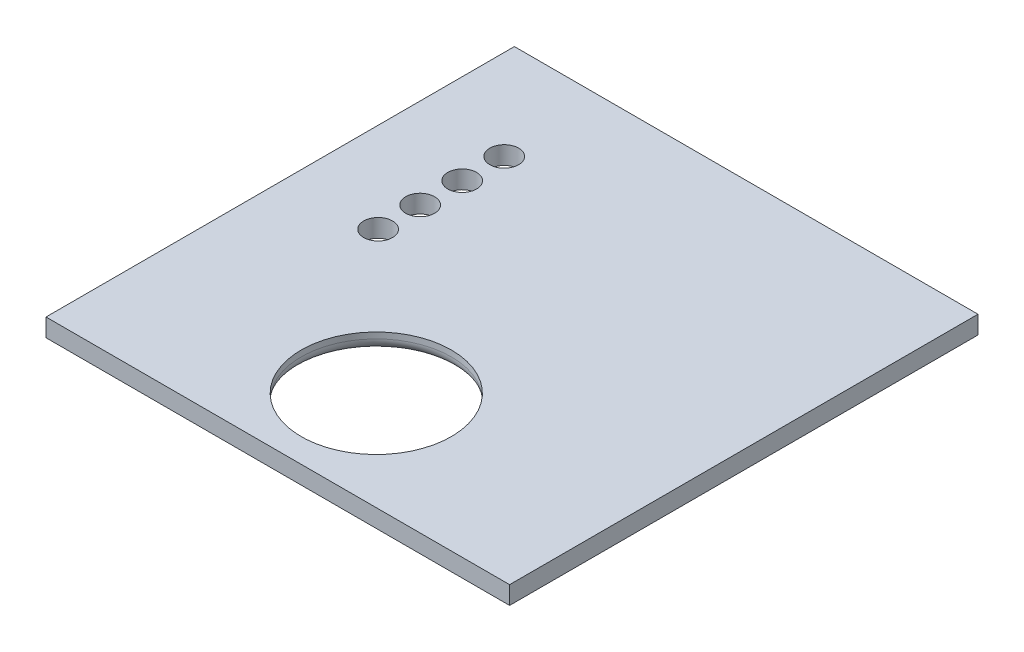
ISO-10303-21;
HEADER;
FILE_DESCRIPTION(('STEP AP214'),'2;1');
FILE_NAME('part.step','',(''),(''),'','','');
FILE_SCHEMA(('AUTOMOTIVE_DESIGN { 1 0 10303 214 1 1 1 1 }'));
ENDSEC;
DATA;
#1=APPLICATION_CONTEXT('core data for automotive mechanical design processes');
#2=APPLICATION_PROTOCOL_DEFINITION('international standard','automotive_design',2000,#1);
#3=PRODUCT_CONTEXT('',#1,'mechanical');
#4=PRODUCT('Part','Part','',(#3));
#5=PRODUCT_RELATED_PRODUCT_CATEGORY('part','',(#4));
#6=PRODUCT_DEFINITION_FORMATION('','',#4);
#7=PRODUCT_DEFINITION_CONTEXT('part definition',#1,'design');
#8=PRODUCT_DEFINITION('design','',#6,#7);
#9=PRODUCT_DEFINITION_SHAPE('','',#8);
#10=(LENGTH_UNIT() NAMED_UNIT(*) SI_UNIT(.MILLI.,.METRE.));
#11=(NAMED_UNIT(*) PLANE_ANGLE_UNIT() SI_UNIT($,.RADIAN.));
#12=(NAMED_UNIT(*) SI_UNIT($,.STERADIAN.) SOLID_ANGLE_UNIT());
#13=UNCERTAINTY_MEASURE_WITH_UNIT(LENGTH_MEASURE(1.E-05),#10,'distance_accuracy_value','');
#14=(GEOMETRIC_REPRESENTATION_CONTEXT(3) GLOBAL_UNCERTAINTY_ASSIGNED_CONTEXT((#13)) GLOBAL_UNIT_ASSIGNED_CONTEXT((#10,
#11,#12)) REPRESENTATION_CONTEXT('',''));
#15=CARTESIAN_POINT('',(0.,0.,0.));
#16=DIRECTION('',(0.,0.,1.));
#17=DIRECTION('',(1.,0.,0.));
#18=AXIS2_PLACEMENT_3D('',#15,#16,#17);
#19=CARTESIAN_POINT('',(0.,0.,0.));
#20=DIRECTION('',(0.,1.,0.));
#21=DIRECTION('',(0.,0.,1.));
#22=AXIS2_PLACEMENT_3D('',#19,#20,#21);
#23=PLANE('',#22);
#24=CARTESIAN_POINT('',(-119.676362237991,0.,-25.0492108688671));
#25=DIRECTION('',(0.,1.,0.));
#26=DIRECTION('',(0.,0.,1.));
#27=AXIS2_PLACEMENT_3D('',#24,#25,#26);
#28=CIRCLE('',#27,14.5);
#29=CARTESIAN_POINT('',(-119.676362237991,0.,-10.5492108688671));
#30=VERTEX_POINT('',#29);
#31=EDGE_CURVE('E11',#30,#30,#28,.T.);
#32=ORIENTED_EDGE('',*,*,#31,.T.);
#33=EDGE_LOOP('',(#32));
#34=FACE_BOUND('',#33,.T.);
#35=CARTESIAN_POINT('',(-143.176362237991,0.,-69.8555580653127));
#36=DIRECTION('',(0.,1.,0.));
#37=DIRECTION('',(0.,0.,1.));
#38=AXIS2_PLACEMENT_3D('',#35,#36,#37);
#39=CIRCLE('',#38,2.4);
#40=CARTESIAN_POINT('',(-143.176362237991,0.,-67.4555580653127));
#41=VERTEX_POINT('',#40);
#42=EDGE_CURVE('E128',#41,#41,#39,.F.);
#43=ORIENTED_EDGE('',*,*,#42,.F.);
#44=EDGE_LOOP('',(#43));
#45=FACE_BOUND('',#44,.T.);
#46=CARTESIAN_POINT('',(-143.176362237991,0.,-62.8555580653127));
#47=DIRECTION('',(0.,1.,0.));
#48=DIRECTION('',(0.,0.,1.));
#49=AXIS2_PLACEMENT_3D('',#46,#47,#48);
#50=CIRCLE('',#49,2.4);
#51=CARTESIAN_POINT('',(-143.176362237991,0.,-60.4555580653127));
#52=VERTEX_POINT('',#51);
#53=EDGE_CURVE('E124',#52,#52,#50,.F.);
#54=ORIENTED_EDGE('',*,*,#53,.F.);
#55=EDGE_LOOP('',(#54));
#56=FACE_BOUND('',#55,.T.);
#57=CARTESIAN_POINT('',(-143.176362237991,0.,-55.8555580653127));
#58=DIRECTION('',(0.,1.,0.));
#59=DIRECTION('',(0.,0.,1.));
#60=AXIS2_PLACEMENT_3D('',#57,#58,#59);
#61=CIRCLE('',#60,2.4);
#62=CARTESIAN_POINT('',(-143.176362237991,0.,-53.4555580653127));
#63=VERTEX_POINT('',#62);
#64=EDGE_CURVE('E120',#63,#63,#61,.F.);
#65=ORIENTED_EDGE('',*,*,#64,.F.);
#66=EDGE_LOOP('',(#65));
#67=FACE_BOUND('',#66,.T.);
#68=CARTESIAN_POINT('',(-143.176362237991,0.,-48.8555580653127));
#69=DIRECTION('',(0.,1.,0.));
#70=DIRECTION('',(0.,0.,1.));
#71=AXIS2_PLACEMENT_3D('',#68,#69,#70);
#72=CIRCLE('',#71,2.4);
#73=CARTESIAN_POINT('',(-143.176362237991,0.,-46.4555580653127));
#74=VERTEX_POINT('',#73);
#75=EDGE_CURVE('E115',#74,#74,#72,.F.);
#76=ORIENTED_EDGE('',*,*,#75,.F.);
#77=EDGE_LOOP('',(#76));
#78=FACE_BOUND('',#77,.T.);
#79=DIRECTION('',(0.,0.,1.));
#80=VECTOR('',#79,1.);
#81=CARTESIAN_POINT('',(-158.176362237991,0.,-86.5492108688671));
#82=LINE('',#81,#80);
#83=CARTESIAN_POINT('',(-158.176362237991,0.,-86.5492108688671));
#84=VERTEX_POINT('',#83);
#85=CARTESIAN_POINT('',(-158.176362237991,0.,-8.54921086886712));
#86=VERTEX_POINT('',#85);
#87=EDGE_CURVE('E105',#84,#86,#82,.T.);
#88=ORIENTED_EDGE('',*,*,#87,.F.);
#89=DIRECTION('',(-1.,0.,0.));
#90=VECTOR('',#89,1.);
#91=CARTESIAN_POINT('',(-158.176362237991,0.,-86.5492108688671));
#92=LINE('',#91,#90);
#93=CARTESIAN_POINT('',(-80.9763622379913,0.,-86.5492108688671));
#94=VERTEX_POINT('',#93);
#95=EDGE_CURVE('E77',#94,#84,#92,.T.);
#96=ORIENTED_EDGE('',*,*,#95,.F.);
#97=DIRECTION('',(0.,0.,-1.));
#98=VECTOR('',#97,1.);
#99=CARTESIAN_POINT('',(-80.9763622379913,0.,-86.5492108688671));
#100=LINE('',#99,#98);
#101=CARTESIAN_POINT('',(-80.9763622379913,0.,-8.54921086886712));
#102=VERTEX_POINT('',#101);
#103=EDGE_CURVE('E71',#102,#94,#100,.T.);
#104=ORIENTED_EDGE('',*,*,#103,.F.);
#105=DIRECTION('',(1.,0.,0.));
#106=VECTOR('',#105,1.);
#107=CARTESIAN_POINT('',(-158.176362237991,0.,-8.54921086886712));
#108=LINE('',#107,#106);
#109=EDGE_CURVE('E95',#86,#102,#108,.T.);
#110=ORIENTED_EDGE('',*,*,#109,.F.);
#111=EDGE_LOOP('',(#88,#96,#104,#110));
#112=FACE_BOUND('',#111,.T.);
#113=ADVANCED_FACE('F37',(#34,#45,#56,#67,#78,#112),#23,.F.);
#114=CARTESIAN_POINT('',(-158.176362237991,3.,-86.5492108688671));
#115=DIRECTION('',(1.,0.,0.));
#116=DIRECTION('',(0.,0.,-1.));
#117=AXIS2_PLACEMENT_3D('',#114,#115,#116);
#118=PLANE('',#117);
#119=ORIENTED_EDGE('',*,*,#87,.T.);
#120=DIRECTION('',(0.,-1.,0.));
#121=VECTOR('',#120,1.);
#122=CARTESIAN_POINT('',(-158.176362237991,3.,-8.54921086886712));
#123=LINE('',#122,#121);
#124=CARTESIAN_POINT('',(-158.176362237991,3.,-8.54921086886712));
#125=VERTEX_POINT('',#124);
#126=EDGE_CURVE('E96',#125,#86,#123,.T.);
#127=ORIENTED_EDGE('',*,*,#126,.F.);
#128=DIRECTION('',(0.,0.,1.));
#129=VECTOR('',#128,1.);
#130=CARTESIAN_POINT('',(-158.176362237991,3.,-86.5492108688671));
#131=LINE('',#130,#129);
#132=CARTESIAN_POINT('',(-158.176362237991,3.,-86.5492108688671));
#133=VERTEX_POINT('',#132);
#134=EDGE_CURVE('E90',#133,#125,#131,.T.);
#135=ORIENTED_EDGE('',*,*,#134,.F.);
#136=DIRECTION('',(0.,-1.,0.));
#137=VECTOR('',#136,1.);
#138=CARTESIAN_POINT('',(-158.176362237991,3.,-86.5492108688671));
#139=LINE('',#138,#137);
#140=EDGE_CURVE('E101',#133,#84,#139,.T.);
#141=ORIENTED_EDGE('',*,*,#140,.T.);
#142=EDGE_LOOP('',(#119,#127,#135,#141));
#143=FACE_BOUND('',#142,.T.);
#144=ADVANCED_FACE('F145',(#143),#118,.F.);
#145=CARTESIAN_POINT('',(-158.176362237991,3.,-8.54921086886712));
#146=DIRECTION('',(0.,0.,-1.));
#147=DIRECTION('',(-1.,0.,0.));
#148=AXIS2_PLACEMENT_3D('',#145,#146,#147);
#149=PLANE('',#148);
#150=ORIENTED_EDGE('',*,*,#109,.T.);
#151=DIRECTION('',(0.,-1.,0.));
#152=VECTOR('',#151,1.);
#153=CARTESIAN_POINT('',(-80.9763622379913,3.,-8.54921086886712));
#154=LINE('',#153,#152);
#155=CARTESIAN_POINT('',(-80.9763622379913,3.,-8.54921086886712));
#156=VERTEX_POINT('',#155);
#157=EDGE_CURVE('E93',#156,#102,#154,.T.);
#158=ORIENTED_EDGE('',*,*,#157,.F.);
#159=DIRECTION('',(1.,0.,0.));
#160=VECTOR('',#159,1.);
#161=CARTESIAN_POINT('',(-158.176362237991,3.,-8.54921086886712));
#162=LINE('',#161,#160);
#163=EDGE_CURVE('E85',#125,#156,#162,.T.);
#164=ORIENTED_EDGE('',*,*,#163,.F.);
#165=ORIENTED_EDGE('',*,*,#126,.T.);
#166=EDGE_LOOP('',(#150,#158,#164,#165));
#167=FACE_BOUND('',#166,.T.);
#168=ADVANCED_FACE('F94',(#167),#149,.F.);
#169=CARTESIAN_POINT('',(-80.9763622379913,3.,-86.5492108688671));
#170=DIRECTION('',(-1.,0.,0.));
#171=DIRECTION('',(0.,0.,1.));
#172=AXIS2_PLACEMENT_3D('',#169,#170,#171);
#173=PLANE('',#172);
#174=ORIENTED_EDGE('',*,*,#103,.T.);
#175=DIRECTION('',(0.,-1.,0.));
#176=VECTOR('',#175,1.);
#177=CARTESIAN_POINT('',(-80.9763622379913,3.,-86.5492108688671));
#178=LINE('',#177,#176);
#179=CARTESIAN_POINT('',(-80.9763622379913,3.,-86.5492108688671));
#180=VERTEX_POINT('',#179);
#181=EDGE_CURVE('E97',#180,#94,#178,.T.);
#182=ORIENTED_EDGE('',*,*,#181,.F.);
#183=DIRECTION('',(0.,0.,-1.));
#184=VECTOR('',#183,1.);
#185=CARTESIAN_POINT('',(-80.9763622379913,3.,-86.5492108688671));
#186=LINE('',#185,#184);
#187=EDGE_CURVE('E88',#156,#180,#186,.T.);
#188=ORIENTED_EDGE('',*,*,#187,.F.);
#189=ORIENTED_EDGE('',*,*,#157,.T.);
#190=EDGE_LOOP('',(#174,#182,#188,#189));
#191=FACE_BOUND('',#190,.T.);
#192=ADVANCED_FACE('F99',(#191),#173,.F.);
#193=CARTESIAN_POINT('',(-158.176362237991,3.,-86.5492108688671));
#194=DIRECTION('',(0.,0.,1.));
#195=DIRECTION('',(1.,0.,0.));
#196=AXIS2_PLACEMENT_3D('',#193,#194,#195);
#197=PLANE('',#196);
#198=ORIENTED_EDGE('',*,*,#95,.T.);
#199=ORIENTED_EDGE('',*,*,#140,.F.);
#200=DIRECTION('',(-1.,0.,0.));
#201=VECTOR('',#200,1.);
#202=CARTESIAN_POINT('',(-158.176362237991,3.,-86.5492108688671));
#203=LINE('',#202,#201);
#204=EDGE_CURVE('E54',#180,#133,#203,.T.);
#205=ORIENTED_EDGE('',*,*,#204,.F.);
#206=ORIENTED_EDGE('',*,*,#181,.T.);
#207=EDGE_LOOP('',(#198,#199,#205,#206));
#208=FACE_BOUND('',#207,.T.);
#209=ADVANCED_FACE('F158',(#208),#197,.F.);
#210=CARTESIAN_POINT('',(0.,3.,0.));
#211=DIRECTION('',(0.,1.,0.));
#212=DIRECTION('',(0.,0.,1.));
#213=AXIS2_PLACEMENT_3D('',#210,#211,#212);
#214=PLANE('',#213);
#215=CARTESIAN_POINT('',(-119.676362237991,3.,-25.0492108688671));
#216=DIRECTION('',(0.,1.,0.));
#217=DIRECTION('',(0.,0.,1.));
#218=AXIS2_PLACEMENT_3D('',#215,#216,#217);
#219=CIRCLE('',#218,12.5);
#220=CARTESIAN_POINT('',(-119.676362237991,2.99999999999989,-37.5492108688671));
#221=VERTEX_POINT('',#220);
#222=EDGE_CURVE('E119',#221,#221,#219,.F.);
#223=ORIENTED_EDGE('',*,*,#222,.T.);
#224=EDGE_LOOP('',(#223));
#225=FACE_BOUND('',#224,.T.);
#226=CARTESIAN_POINT('',(-143.176362237991,3.,-69.8555580653127));
#227=DIRECTION('',(0.,1.,0.));
#228=DIRECTION('',(0.,0.,1.));
#229=AXIS2_PLACEMENT_3D('',#226,#227,#228);
#230=CIRCLE('',#229,2.4);
#231=CARTESIAN_POINT('',(-143.176362237991,3.,-67.4555580653127));
#232=VERTEX_POINT('',#231);
#233=EDGE_CURVE('E108',#232,#232,#230,.F.);
#234=ORIENTED_EDGE('',*,*,#233,.T.);
#235=EDGE_LOOP('',(#234));
#236=FACE_BOUND('',#235,.T.);
#237=CARTESIAN_POINT('',(-143.176362237991,3.,-62.8555580653127));
#238=DIRECTION('',(0.,1.,0.));
#239=DIRECTION('',(0.,0.,1.));
#240=AXIS2_PLACEMENT_3D('',#237,#238,#239);
#241=CIRCLE('',#240,2.4);
#242=CARTESIAN_POINT('',(-143.176362237991,3.,-60.4555580653127));
#243=VERTEX_POINT('',#242);
#244=EDGE_CURVE('E127',#243,#243,#241,.F.);
#245=ORIENTED_EDGE('',*,*,#244,.T.);
#246=EDGE_LOOP('',(#245));
#247=FACE_BOUND('',#246,.T.);
#248=CARTESIAN_POINT('',(-143.176362237991,3.,-55.8555580653127));
#249=DIRECTION('',(0.,1.,0.));
#250=DIRECTION('',(0.,0.,1.));
#251=AXIS2_PLACEMENT_3D('',#248,#249,#250);
#252=CIRCLE('',#251,2.4);
#253=CARTESIAN_POINT('',(-143.176362237991,3.,-53.4555580653127));
#254=VERTEX_POINT('',#253);
#255=EDGE_CURVE('E123',#254,#254,#252,.F.);
#256=ORIENTED_EDGE('',*,*,#255,.T.);
#257=EDGE_LOOP('',(#256));
#258=FACE_BOUND('',#257,.T.);
#259=CARTESIAN_POINT('',(-143.176362237991,3.,-48.8555580653127));
#260=DIRECTION('',(0.,1.,0.));
#261=DIRECTION('',(0.,0.,1.));
#262=AXIS2_PLACEMENT_3D('',#259,#260,#261);
#263=CIRCLE('',#262,2.4);
#264=CARTESIAN_POINT('',(-143.176362237991,3.,-46.4555580653127));
#265=VERTEX_POINT('',#264);
#266=EDGE_CURVE('E118',#265,#265,#263,.F.);
#267=ORIENTED_EDGE('',*,*,#266,.T.);
#268=EDGE_LOOP('',(#267));
#269=FACE_BOUND('',#268,.T.);
#270=ORIENTED_EDGE('',*,*,#134,.T.);
#271=ORIENTED_EDGE('',*,*,#163,.T.);
#272=ORIENTED_EDGE('',*,*,#187,.T.);
#273=ORIENTED_EDGE('',*,*,#204,.T.);
#274=EDGE_LOOP('',(#270,#271,#272,#273));
#275=FACE_BOUND('',#274,.T.);
#276=ADVANCED_FACE('F86',(#225,#236,#247,#258,#269,#275),#214,.T.);
#277=CARTESIAN_POINT('',(-143.176362237991,153.,-48.8555580653127));
#278=DIRECTION('',(0.,-1.,0.));
#279=DIRECTION('',(0.,0.,-1.));
#280=AXIS2_PLACEMENT_3D('',#277,#278,#279);
#281=CYLINDRICAL_SURFACE('',#280,2.4);
#282=ORIENTED_EDGE('',*,*,#266,.F.);
#283=EDGE_LOOP('',(#282));
#284=FACE_BOUND('',#283,.T.);
#285=ORIENTED_EDGE('',*,*,#75,.T.);
#286=EDGE_LOOP('',(#285));
#287=FACE_BOUND('',#286,.T.);
#288=ADVANCED_FACE('F180',(#284,#287),#281,.F.);
#289=CARTESIAN_POINT('',(-143.176362237991,153.,-55.8555580653127));
#290=DIRECTION('',(0.,-1.,0.));
#291=DIRECTION('',(0.,0.,-1.));
#292=AXIS2_PLACEMENT_3D('',#289,#290,#291);
#293=CYLINDRICAL_SURFACE('',#292,2.4);
#294=ORIENTED_EDGE('',*,*,#255,.F.);
#295=EDGE_LOOP('',(#294));
#296=FACE_BOUND('',#295,.T.);
#297=ORIENTED_EDGE('',*,*,#64,.T.);
#298=EDGE_LOOP('',(#297));
#299=FACE_BOUND('',#298,.T.);
#300=ADVANCED_FACE('F183',(#296,#299),#293,.F.);
#301=CARTESIAN_POINT('',(-143.176362237991,153.,-62.8555580653127));
#302=DIRECTION('',(0.,-1.,0.));
#303=DIRECTION('',(0.,0.,-1.));
#304=AXIS2_PLACEMENT_3D('',#301,#302,#303);
#305=CYLINDRICAL_SURFACE('',#304,2.4);
#306=ORIENTED_EDGE('',*,*,#244,.F.);
#307=EDGE_LOOP('',(#306));
#308=FACE_BOUND('',#307,.T.);
#309=ORIENTED_EDGE('',*,*,#53,.T.);
#310=EDGE_LOOP('',(#309));
#311=FACE_BOUND('',#310,.T.);
#312=ADVANCED_FACE('F190',(#308,#311),#305,.F.);
#313=CARTESIAN_POINT('',(-143.176362237991,153.,-69.8555580653127));
#314=DIRECTION('',(0.,-1.,0.));
#315=DIRECTION('',(0.,0.,-1.));
#316=AXIS2_PLACEMENT_3D('',#313,#314,#315);
#317=CYLINDRICAL_SURFACE('',#316,2.4);
#318=ORIENTED_EDGE('',*,*,#233,.F.);
#319=EDGE_LOOP('',(#318));
#320=FACE_BOUND('',#319,.T.);
#321=ORIENTED_EDGE('',*,*,#42,.T.);
#322=EDGE_LOOP('',(#321));
#323=FACE_BOUND('',#322,.T.);
#324=ADVANCED_FACE('F141',(#320,#323),#317,.F.);
#325=CARTESIAN_POINT('',(-119.676362237991,647.,-25.0492108688671));
#326=DIRECTION('',(0.,-1.,0.));
#327=DIRECTION('',(0.,0.,-1.));
#328=AXIS2_PLACEMENT_3D('',#325,#326,#327);
#329=CYLINDRICAL_SURFACE('',#328,12.5);
#330=CARTESIAN_POINT('',(-119.676362237991,2.,-25.0492108688671));
#331=DIRECTION('',(0.,1.,0.));
#332=DIRECTION('',(0.,0.,1.));
#333=AXIS2_PLACEMENT_3D('',#330,#331,#332);
#334=CIRCLE('',#333,12.5);
#335=CARTESIAN_POINT('',(-119.676362237991,2.,-37.5492108688671));
#336=VERTEX_POINT('',#335);
#337=EDGE_CURVE('E46',#336,#336,#334,.F.);
#338=CARTESIAN_POINT('',(-119.676362237991,2.,-37.5492108688671));
#339=CARTESIAN_POINT('',(-119.676362237991,2.01041666666668,-37.5492108688671));
#340=CARTESIAN_POINT('',(-119.676362237991,2.02083333333336,-37.5492108688671));
#341=CARTESIAN_POINT('',(-119.676362237991,2.04166666666668,-37.5492108688671));
#342=CARTESIAN_POINT('',(-119.676362237991,2.05208333333332,-37.5492108688671));
#343=CARTESIAN_POINT('',(-119.676362237991,2.07291666666665,-37.5492108688671));
#344=CARTESIAN_POINT('',(-119.676362237991,2.08333333333333,-37.5492108688671));
#345=CARTESIAN_POINT('',(-119.676362237991,2.10416666666665,-37.5492108688671));
#346=CARTESIAN_POINT('',(-119.676362237991,2.11458333333329,-37.5492108688671));
#347=CARTESIAN_POINT('',(-119.676362237991,2.13541666666661,-37.5492108688671));
#348=CARTESIAN_POINT('',(-119.676362237991,2.14583333333329,-37.5492108688671));
#349=CARTESIAN_POINT('',(-119.676362237991,2.16666666666665,-37.5492108688671));
#350=CARTESIAN_POINT('',(-119.676362237991,2.17708333333333,-37.5492108688671));
#351=CARTESIAN_POINT('',(-119.676362237991,2.19791666666665,-37.5492108688671));
#352=CARTESIAN_POINT('',(-119.676362237991,2.20833333333329,-37.5492108688671));
#353=CARTESIAN_POINT('',(-119.676362237991,2.22916666666662,-37.5492108688671));
#354=CARTESIAN_POINT('',(-119.676362237991,2.23958333333329,-37.5492108688671));
#355=CARTESIAN_POINT('',(-119.676362237991,2.26041666666665,-37.5492108688671));
#356=CARTESIAN_POINT('',(-119.676362237991,2.27083333333333,-37.5492108688671));
#357=CARTESIAN_POINT('',(-119.676362237991,2.29166666666665,-37.5492108688671));
#358=CARTESIAN_POINT('',(-119.676362237991,2.3020833333333,-37.5492108688671));
#359=CARTESIAN_POINT('',(-119.676362237991,2.32291666666662,-37.5492108688671));
#360=CARTESIAN_POINT('',(-119.676362237991,2.3333333333333,-37.5492108688671));
#361=CARTESIAN_POINT('',(-119.676362237991,2.35416666666666,-37.5492108688671));
#362=CARTESIAN_POINT('',(-119.676362237991,2.36458333333334,-37.5492108688671));
#363=CARTESIAN_POINT('',(-119.676362237991,2.38541666666666,-37.5492108688671));
#364=CARTESIAN_POINT('',(-119.676362237991,2.3958333333333,-37.5492108688671));
#365=CARTESIAN_POINT('',(-119.676362237991,2.41666666666662,-37.5492108688671));
#366=CARTESIAN_POINT('',(-119.676362237991,2.4270833333333,-37.5492108688671));
#367=CARTESIAN_POINT('',(-119.676362237991,2.44791666666662,-37.5492108688671));
#368=CARTESIAN_POINT('',(-119.676362237991,2.45833333333327,-37.5492108688671));
#369=CARTESIAN_POINT('',(-119.676362237991,2.47916666666659,-37.5492108688671));
#370=CARTESIAN_POINT('',(-119.676362237991,2.48958333333327,-37.5492108688671));
#371=CARTESIAN_POINT('',(-119.676362237991,2.51041666666663,-37.5492108688671));
#372=CARTESIAN_POINT('',(-119.676362237991,2.52083333333331,-37.5492108688671));
#373=CARTESIAN_POINT('',(-119.676362237991,2.54166666666663,-37.5492108688671));
#374=CARTESIAN_POINT('',(-119.676362237991,2.55208333333327,-37.5492108688671));
#375=CARTESIAN_POINT('',(-119.676362237991,2.57291666666659,-37.5492108688671));
#376=CARTESIAN_POINT('',(-119.676362237991,2.58333333333327,-37.5492108688671));
#377=CARTESIAN_POINT('',(-119.676362237991,2.60416666666659,-37.5492108688671));
#378=CARTESIAN_POINT('',(-119.676362237991,2.61458333333323,-37.5492108688671));
#379=CARTESIAN_POINT('',(-119.676362237991,2.63541666666656,-37.5492108688671));
#380=CARTESIAN_POINT('',(-119.676362237991,2.64583333333324,-37.5492108688671));
#381=CARTESIAN_POINT('',(-119.676362237991,2.6666666666666,-37.5492108688671));
#382=CARTESIAN_POINT('',(-119.676362237991,2.67708333333327,-37.5492108688671));
#383=CARTESIAN_POINT('',(-119.676362237991,2.6979166666666,-37.5492108688671));
#384=CARTESIAN_POINT('',(-119.676362237991,2.70833333333324,-37.5492108688671));
#385=CARTESIAN_POINT('',(-119.676362237991,2.72916666666656,-37.5492108688671));
#386=CARTESIAN_POINT('',(-119.676362237991,2.73958333333324,-37.5492108688671));
#387=CARTESIAN_POINT('',(-119.676362237991,2.7604166666666,-37.5492108688671));
#388=CARTESIAN_POINT('',(-119.676362237991,2.77083333333328,-37.5492108688671));
#389=CARTESIAN_POINT('',(-119.676362237991,2.7916666666666,-37.5492108688671));
#390=CARTESIAN_POINT('',(-119.676362237991,2.80208333333324,-37.5492108688671));
#391=CARTESIAN_POINT('',(-119.676362237991,2.82291666666656,-37.5492108688671));
#392=CARTESIAN_POINT('',(-119.676362237991,2.83333333333324,-37.5492108688671));
#393=CARTESIAN_POINT('',(-119.676362237991,2.8541666666666,-37.5492108688671));
#394=CARTESIAN_POINT('',(-119.676362237991,2.86458333333328,-37.5492108688671));
#395=CARTESIAN_POINT('',(-119.676362237991,2.8854166666666,-37.5492108688671));
#396=CARTESIAN_POINT('',(-119.676362237991,2.89583333333325,-37.5492108688671));
#397=CARTESIAN_POINT('',(-119.676362237991,2.91666666666657,-37.5492108688671));
#398=CARTESIAN_POINT('',(-119.676362237991,2.92708333333325,-37.5492108688671));
#399=CARTESIAN_POINT('',(-119.676362237991,2.94791666666657,-37.5492108688671));
#400=CARTESIAN_POINT('',(-119.676362237991,2.95833333333321,-37.5492108688671));
#401=CARTESIAN_POINT('',(-119.676362237991,2.97916666666653,-37.5492108688671));
#402=CARTESIAN_POINT('',(-119.676362237991,2.98958333333321,-37.5492108688671));
#403=CARTESIAN_POINT('',(-119.676362237991,2.99999999999989,-37.5492108688671));
#404=B_SPLINE_CURVE_WITH_KNOTS('',3,(#338,#339,#340,#341,#342,#343,#344,#345,#346,#347,#348,
#349,#350,#351,#352,#353,#354,#355,#356,#357,#358,#359,#360,#361,#362,#363,#364,#365,#366,#367,
#368,#369,#370,#371,#372,#373,#374,#375,#376,#377,#378,#379,#380,#381,#382,#383,#384,#385,#386,
#387,#388,#389,#390,#391,#392,#393,#394,#395,#396,#397,#398,#399,#400,#401,#402,#403),
.UNSPECIFIED.,.F.,.F.,(4,2,2,2,2,2,2,2,2,2,2,2,2,2,2,2,2,2,2,2,2,2,2,2,2,2,2,2,2,2,2,2,4),(0.,
0.0312500000000382,0.0624999999999654,0.0937500000000036,0.124999999999931,0.156249999999969,
0.187500000000007,0.218749999999934,0.249999999999972,0.281250000000011,0.312499999999938,
0.343749999999976,0.375000000000014,0.406249999999941,0.43749999999998,0.468749999999907,
0.499999999999945,0.531249999999983,0.56249999999991,0.593749999999948,0.624999999999876,
0.656249999999914,0.687499999999952,0.718749999999879,0.749999999999917,0.781249999999956,
0.812499999999883,0.843749999999921,0.874999999999959,0.906249999999886,0.937499999999925,
0.968749999999852,0.99999999999989),.UNSPECIFIED.);
#405=EDGE_CURVE('BSEAM133',#336,#221,#404,.T.);
#406=ORIENTED_EDGE('',*,*,#337,.T.);
#407=ORIENTED_EDGE('',*,*,#222,.F.);
#408=ORIENTED_EDGE('',*,*,#405,.T.);
#409=ORIENTED_EDGE('',*,*,#405,.F.);
#410=EDGE_LOOP('',(#406,#408,#407,#409));
#411=FACE_BOUND('',#410,.T.);
#412=ADVANCED_FACE('F133',(#411),#329,.F.);
#413=CARTESIAN_POINT('',(-119.676362237991,2.,-25.0492108688671));
#414=DIRECTION('',(0.,1.,0.));
#415=DIRECTION('',(0.,0.,1.));
#416=AXIS2_PLACEMENT_3D('',#413,#414,#415);
#417=TOROIDAL_SURFACE('',#416,14.5,2.);
#418=ORIENTED_EDGE('',*,*,#31,.F.);
#419=EDGE_LOOP('',(#418));
#420=FACE_BOUND('',#419,.T.);
#421=ORIENTED_EDGE('',*,*,#337,.F.);
#422=EDGE_LOOP('',(#421));
#423=FACE_BOUND('',#422,.T.);
#424=ADVANCED_FACE('F39',(#420,#423),#417,.T.);
#425=CLOSED_SHELL('',(#113,#144,#168,#192,#209,#276,#288,#300,#312,#324,#412,#424));
#426=MANIFOLD_SOLID_BREP('B2',#425);
#427=ADVANCED_BREP_SHAPE_REPRESENTATION('',(#18,#426),#14);
#428=SHAPE_DEFINITION_REPRESENTATION(#9,#427);
ENDSEC;
END-ISO-10303-21;
